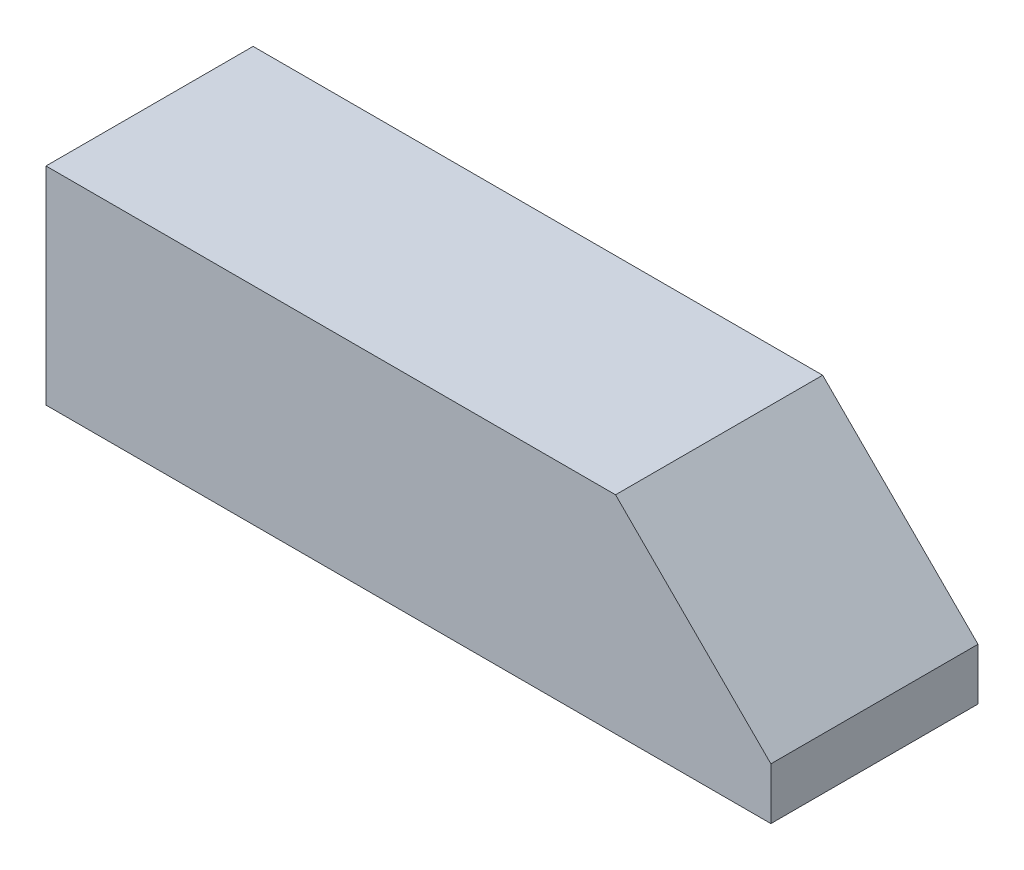
ISO-10303-21;
HEADER;
FILE_DESCRIPTION(('STEP AP214'),'2;1');
FILE_NAME('part.step','',(''),(''),'','','');
FILE_SCHEMA(('AUTOMOTIVE_DESIGN { 1 0 10303 214 1 1 1 1 }'));
ENDSEC;
DATA;
#1=APPLICATION_CONTEXT('core data for automotive mechanical design processes');
#2=APPLICATION_PROTOCOL_DEFINITION('international standard','automotive_design',2000,#1);
#3=PRODUCT_CONTEXT('',#1,'mechanical');
#4=PRODUCT('Part','Part','',(#3));
#5=PRODUCT_RELATED_PRODUCT_CATEGORY('part','',(#4));
#6=PRODUCT_DEFINITION_FORMATION('','',#4);
#7=PRODUCT_DEFINITION_CONTEXT('part definition',#1,'design');
#8=PRODUCT_DEFINITION('design','',#6,#7);
#9=PRODUCT_DEFINITION_SHAPE('','',#8);
#10=(LENGTH_UNIT() NAMED_UNIT(*) SI_UNIT(.MILLI.,.METRE.));
#11=(NAMED_UNIT(*) PLANE_ANGLE_UNIT() SI_UNIT($,.RADIAN.));
#12=(NAMED_UNIT(*) SI_UNIT($,.STERADIAN.) SOLID_ANGLE_UNIT());
#13=UNCERTAINTY_MEASURE_WITH_UNIT(LENGTH_MEASURE(1.E-05),#10,'distance_accuracy_value','');
#14=(GEOMETRIC_REPRESENTATION_CONTEXT(3) GLOBAL_UNCERTAINTY_ASSIGNED_CONTEXT((#13)) GLOBAL_UNIT_ASSIGNED_CONTEXT((#10,
#11,#12)) REPRESENTATION_CONTEXT('',''));
#15=CARTESIAN_POINT('',(0.,0.,0.));
#16=DIRECTION('',(0.,0.,1.));
#17=DIRECTION('',(1.,0.,0.));
#18=AXIS2_PLACEMENT_3D('',#15,#16,#17);
#19=CARTESIAN_POINT('',(-1.15000001937151,0.99999999627471,0.));
#20=DIRECTION('',(0.,1.,0.));
#21=DIRECTION('',(0.,0.,1.));
#22=AXIS2_PLACEMENT_3D('',#19,#20,#21);
#23=PLANE('',#22);
#24=DIRECTION('',(0.,0.,1.));
#25=VECTOR('',#24,1.);
#26=CARTESIAN_POINT('',(-1.50000004172325,0.99999999627471,0.));
#27=LINE('',#26,#25);
#28=CARTESIAN_POINT('',(-1.50000004172325,0.99999999627471,0.2));
#29=VERTEX_POINT('',#28);
#30=CARTESIAN_POINT('',(-1.50000004172325,0.99999999627471,0.));
#31=VERTEX_POINT('',#30);
#32=EDGE_CURVE('E74',#29,#31,#27,.F.);
#33=ORIENTED_EDGE('',*,*,#32,.F.);
#34=DIRECTION('',(1.,0.,0.));
#35=VECTOR('',#34,1.);
#36=CARTESIAN_POINT('',(-1.15000001937151,0.99999999627471,0.2));
#37=LINE('',#36,#35);
#38=CARTESIAN_POINT('',(-0.949999997019767,0.99999999627471,0.2));
#39=VERTEX_POINT('',#38);
#40=EDGE_CURVE('E62',#39,#29,#37,.F.);
#41=ORIENTED_EDGE('',*,*,#40,.F.);
#42=DIRECTION('',(0.,0.,1.));
#43=VECTOR('',#42,1.);
#44=CARTESIAN_POINT('',(-0.949999997019767,0.99999999627471,0.));
#45=LINE('',#44,#43);
#46=CARTESIAN_POINT('',(-0.949999997019767,0.99999999627471,0.));
#47=VERTEX_POINT('',#46);
#48=EDGE_CURVE('E20',#47,#39,#45,.T.);
#49=ORIENTED_EDGE('',*,*,#48,.F.);
#50=DIRECTION('',(1.,0.,0.));
#51=VECTOR('',#50,1.);
#52=CARTESIAN_POINT('',(-1.15000001937151,0.99999999627471,0.));
#53=LINE('',#52,#51);
#54=EDGE_CURVE('E85',#47,#31,#53,.F.);
#55=ORIENTED_EDGE('',*,*,#54,.T.);
#56=EDGE_LOOP('',(#33,#41,#49,#55));
#57=FACE_BOUND('',#56,.T.);
#58=ADVANCED_FACE('F17',(#57),#23,.T.);
#59=CARTESIAN_POINT('',(-0.874999997019767,0.92499999627471,0.));
#60=DIRECTION('',(0.707106781186548,0.707106781186548,0.));
#61=DIRECTION('',(-0.707106781186548,0.707106781186548,0.));
#62=AXIS2_PLACEMENT_3D('',#59,#60,#61);
#63=PLANE('',#62);
#64=DIRECTION('',(-0.707106781186548,0.707106781186548,0.));
#65=VECTOR('',#64,1.);
#66=CARTESIAN_POINT('',(-0.799999997019768,0.84999999627471,0.));
#67=LINE('',#66,#65);
#68=CARTESIAN_POINT('',(-0.799999997019768,0.84999999627471,0.));
#69=VERTEX_POINT('',#68);
#70=EDGE_CURVE('E70',#69,#47,#67,.T.);
#71=ORIENTED_EDGE('',*,*,#70,.T.);
#72=ORIENTED_EDGE('',*,*,#48,.T.);
#73=DIRECTION('',(-0.707106781186548,0.707106781186548,0.));
#74=VECTOR('',#73,1.);
#75=CARTESIAN_POINT('',(-0.799999997019768,0.84999999627471,0.2));
#76=LINE('',#75,#74);
#77=CARTESIAN_POINT('',(-0.799999997019768,0.84999999627471,0.2));
#78=VERTEX_POINT('',#77);
#79=EDGE_CURVE('E68',#78,#39,#76,.T.);
#80=ORIENTED_EDGE('',*,*,#79,.F.);
#81=DIRECTION('',(0.,0.,-1.));
#82=VECTOR('',#81,1.);
#83=CARTESIAN_POINT('',(-0.799999997019768,0.84999999627471,0.));
#84=LINE('',#83,#82);
#85=EDGE_CURVE('E90',#69,#78,#84,.F.);
#86=ORIENTED_EDGE('',*,*,#85,.F.);
#87=EDGE_LOOP('',(#71,#72,#80,#86));
#88=FACE_BOUND('',#87,.T.);
#89=ADVANCED_FACE('F67',(#88),#63,.T.);
#90=CARTESIAN_POINT('',(-1.15000001937151,0.89999999664724,0.2));
#91=DIRECTION('',(0.,0.,1.));
#92=DIRECTION('',(1.,0.,0.));
#93=AXIS2_PLACEMENT_3D('',#90,#91,#92);
#94=PLANE('',#93);
#95=DIRECTION('',(1.,0.,0.));
#96=VECTOR('',#95,1.);
#97=CARTESIAN_POINT('',(-1.15000001937151,0.799999997019768,0.2));
#98=LINE('',#97,#96);
#99=CARTESIAN_POINT('',(-0.799999997019768,0.799999997019768,0.2));
#100=VERTEX_POINT('',#99);
#101=CARTESIAN_POINT('',(-1.50000004172325,0.799999997019768,0.2));
#102=VERTEX_POINT('',#101);
#103=EDGE_CURVE('E94',#100,#102,#98,.F.);
#104=ORIENTED_EDGE('',*,*,#103,.F.);
#105=DIRECTION('',(0.,1.,0.));
#106=VECTOR('',#105,1.);
#107=CARTESIAN_POINT('',(-0.799999997019768,0.89999999664724,0.2));
#108=LINE('',#107,#106);
#109=EDGE_CURVE('E80',#78,#100,#108,.F.);
#110=ORIENTED_EDGE('',*,*,#109,.F.);
#111=ORIENTED_EDGE('',*,*,#79,.T.);
#112=ORIENTED_EDGE('',*,*,#40,.T.);
#113=DIRECTION('',(0.,1.,0.));
#114=VECTOR('',#113,1.);
#115=CARTESIAN_POINT('',(-1.50000004172325,0.89999999664724,0.2));
#116=LINE('',#115,#114);
#117=EDGE_CURVE('E76',#102,#29,#116,.T.);
#118=ORIENTED_EDGE('',*,*,#117,.F.);
#119=EDGE_LOOP('',(#104,#110,#111,#112,#118));
#120=FACE_BOUND('',#119,.T.);
#121=ADVANCED_FACE('F78',(#120),#94,.T.);
#122=CARTESIAN_POINT('',(-1.50000004172325,0.89999999664724,0.));
#123=DIRECTION('',(-1.,0.,0.));
#124=DIRECTION('',(0.,0.,1.));
#125=AXIS2_PLACEMENT_3D('',#122,#123,#124);
#126=PLANE('',#125);
#127=DIRECTION('',(0.,1.,0.));
#128=VECTOR('',#127,1.);
#129=CARTESIAN_POINT('',(-1.50000004172325,0.89999999664724,0.));
#130=LINE('',#129,#128);
#131=CARTESIAN_POINT('',(-1.50000004172325,0.799999997019768,0.));
#132=VERTEX_POINT('',#131);
#133=EDGE_CURVE('E87',#31,#132,#130,.F.);
#134=ORIENTED_EDGE('',*,*,#133,.T.);
#135=DIRECTION('',(0.,0.,-1.));
#136=VECTOR('',#135,1.);
#137=CARTESIAN_POINT('',(-1.50000004172325,0.799999997019768,0.));
#138=LINE('',#137,#136);
#139=EDGE_CURVE('E97',#102,#132,#138,.T.);
#140=ORIENTED_EDGE('',*,*,#139,.F.);
#141=ORIENTED_EDGE('',*,*,#117,.T.);
#142=ORIENTED_EDGE('',*,*,#32,.T.);
#143=EDGE_LOOP('',(#134,#140,#141,#142));
#144=FACE_BOUND('',#143,.T.);
#145=ADVANCED_FACE('F107',(#144),#126,.T.);
#146=CARTESIAN_POINT('',(-1.15000001937151,0.89999999664724,0.));
#147=DIRECTION('',(0.,0.,1.));
#148=DIRECTION('',(1.,0.,0.));
#149=AXIS2_PLACEMENT_3D('',#146,#147,#148);
#150=PLANE('',#149);
#151=DIRECTION('',(0.,1.,0.));
#152=VECTOR('',#151,1.);
#153=CARTESIAN_POINT('',(-0.799999997019768,0.89999999664724,0.));
#154=LINE('',#153,#152);
#155=CARTESIAN_POINT('',(-0.799999997019768,0.799999997019768,0.));
#156=VERTEX_POINT('',#155);
#157=EDGE_CURVE('E35',#156,#69,#154,.T.);
#158=ORIENTED_EDGE('',*,*,#157,.F.);
#159=DIRECTION('',(1.,0.,0.));
#160=VECTOR('',#159,1.);
#161=CARTESIAN_POINT('',(-1.15000001937151,0.799999997019768,0.));
#162=LINE('',#161,#160);
#163=EDGE_CURVE('E26',#132,#156,#162,.T.);
#164=ORIENTED_EDGE('',*,*,#163,.F.);
#165=ORIENTED_EDGE('',*,*,#133,.F.);
#166=ORIENTED_EDGE('',*,*,#54,.F.);
#167=ORIENTED_EDGE('',*,*,#70,.F.);
#168=EDGE_LOOP('',(#158,#164,#165,#166,#167));
#169=FACE_BOUND('',#168,.T.);
#170=ADVANCED_FACE('F105',(#169),#150,.F.);
#171=CARTESIAN_POINT('',(-0.799999997019768,0.89999999664724,0.));
#172=DIRECTION('',(1.,0.,0.));
#173=DIRECTION('',(0.,0.,-1.));
#174=AXIS2_PLACEMENT_3D('',#171,#172,#173);
#175=PLANE('',#174);
#176=DIRECTION('',(0.,0.,-1.));
#177=VECTOR('',#176,1.);
#178=CARTESIAN_POINT('',(-0.799999997019768,0.799999997019768,0.));
#179=LINE('',#178,#177);
#180=EDGE_CURVE('E11',#156,#100,#179,.F.);
#181=ORIENTED_EDGE('',*,*,#180,.F.);
#182=ORIENTED_EDGE('',*,*,#157,.T.);
#183=ORIENTED_EDGE('',*,*,#85,.T.);
#184=ORIENTED_EDGE('',*,*,#109,.T.);
#185=EDGE_LOOP('',(#181,#182,#183,#184));
#186=FACE_BOUND('',#185,.T.);
#187=ADVANCED_FACE('F109',(#186),#175,.T.);
#188=CARTESIAN_POINT('',(-1.15000001937151,0.799999997019768,0.));
#189=DIRECTION('',(0.,-1.,0.));
#190=DIRECTION('',(0.,0.,-1.));
#191=AXIS2_PLACEMENT_3D('',#188,#189,#190);
#192=PLANE('',#191);
#193=ORIENTED_EDGE('',*,*,#163,.T.);
#194=ORIENTED_EDGE('',*,*,#180,.T.);
#195=ORIENTED_EDGE('',*,*,#103,.T.);
#196=ORIENTED_EDGE('',*,*,#139,.T.);
#197=EDGE_LOOP('',(#193,#194,#195,#196));
#198=FACE_BOUND('',#197,.T.);
#199=ADVANCED_FACE('F102',(#198),#192,.T.);
#200=CLOSED_SHELL('',(#58,#89,#121,#145,#170,#187,#199));
#201=MANIFOLD_SOLID_BREP('B1',#200);
#202=ADVANCED_BREP_SHAPE_REPRESENTATION('',(#18,#201),#14);
#203=SHAPE_DEFINITION_REPRESENTATION(#9,#202);
ENDSEC;
END-ISO-10303-21;
